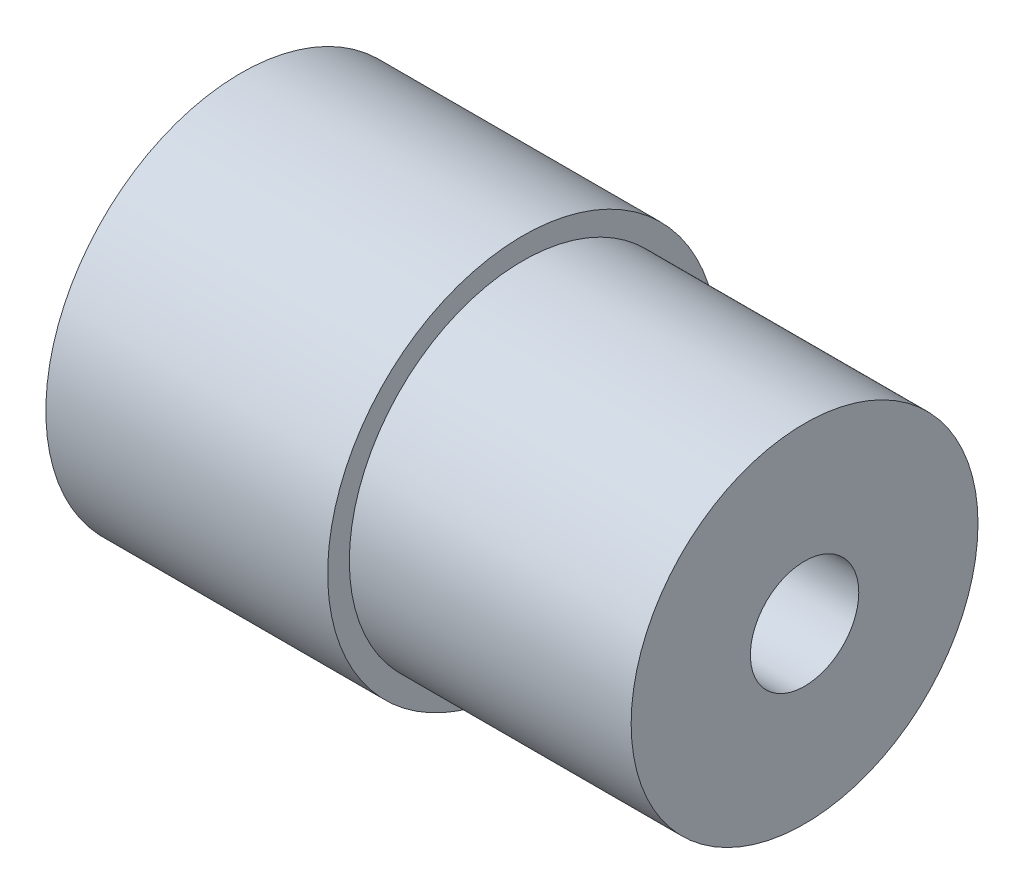
ISO-10303-21;
HEADER;
FILE_DESCRIPTION(('STEP AP214'),'2;1');
FILE_NAME('part.step','',(''),(''),'','','');
FILE_SCHEMA(('AUTOMOTIVE_DESIGN { 1 0 10303 214 1 1 1 1 }'));
ENDSEC;
DATA;
#1=APPLICATION_CONTEXT('core data for automotive mechanical design processes');
#2=APPLICATION_PROTOCOL_DEFINITION('international standard','automotive_design',2000,#1);
#3=PRODUCT_CONTEXT('',#1,'mechanical');
#4=PRODUCT('Part','Part','',(#3));
#5=PRODUCT_RELATED_PRODUCT_CATEGORY('part','',(#4));
#6=PRODUCT_DEFINITION_FORMATION('','',#4);
#7=PRODUCT_DEFINITION_CONTEXT('part definition',#1,'design');
#8=PRODUCT_DEFINITION('design','',#6,#7);
#9=PRODUCT_DEFINITION_SHAPE('','',#8);
#10=(LENGTH_UNIT() NAMED_UNIT(*) SI_UNIT(.MILLI.,.METRE.));
#11=(NAMED_UNIT(*) PLANE_ANGLE_UNIT() SI_UNIT($,.RADIAN.));
#12=(NAMED_UNIT(*) SI_UNIT($,.STERADIAN.) SOLID_ANGLE_UNIT());
#13=UNCERTAINTY_MEASURE_WITH_UNIT(LENGTH_MEASURE(1.E-05),#10,'distance_accuracy_value','');
#14=(GEOMETRIC_REPRESENTATION_CONTEXT(3) GLOBAL_UNCERTAINTY_ASSIGNED_CONTEXT((#13)) GLOBAL_UNIT_ASSIGNED_CONTEXT((#10,
#11,#12)) REPRESENTATION_CONTEXT('',''));
#15=CARTESIAN_POINT('',(0.,0.,0.));
#16=DIRECTION('',(0.,0.,1.));
#17=DIRECTION('',(1.,0.,0.));
#18=AXIS2_PLACEMENT_3D('',#15,#16,#17);
#19=CARTESIAN_POINT('',(0.,0.,0.));
#20=DIRECTION('',(1.,0.,0.));
#21=DIRECTION('',(0.,0.,-1.));
#22=AXIS2_PLACEMENT_3D('',#19,#20,#21);
#23=PLANE('',#22);
#24=CARTESIAN_POINT('',(0.,0.,0.));
#25=DIRECTION('',(1.,0.,0.));
#26=DIRECTION('',(0.,0.,-1.));
#27=AXIS2_PLACEMENT_3D('',#24,#25,#26);
#28=CIRCLE('',#27,2.5);
#29=CARTESIAN_POINT('',(0.,0.,-2.5));
#30=VERTEX_POINT('',#29);
#31=EDGE_CURVE('E58',#30,#30,#28,.T.);
#32=ORIENTED_EDGE('',*,*,#31,.F.);
#33=EDGE_LOOP('',(#32));
#34=FACE_BOUND('',#33,.T.);
#35=CARTESIAN_POINT('',(0.,0.,0.));
#36=DIRECTION('',(1.,0.,0.));
#37=DIRECTION('',(0.,0.,-1.));
#38=AXIS2_PLACEMENT_3D('',#35,#36,#37);
#39=CIRCLE('',#38,8.);
#40=CARTESIAN_POINT('',(0.,0.,-8.));
#41=VERTEX_POINT('',#40);
#42=EDGE_CURVE('E11',#41,#41,#39,.T.);
#43=ORIENTED_EDGE('',*,*,#42,.T.);
#44=EDGE_LOOP('',(#43));
#45=FACE_BOUND('',#44,.T.);
#46=ADVANCED_FACE('F35',(#34,#45),#23,.T.);
#47=CARTESIAN_POINT('',(0.,0.,0.));
#48=DIRECTION('',(1.,0.,0.));
#49=DIRECTION('',(0.,0.,-1.));
#50=AXIS2_PLACEMENT_3D('',#47,#48,#49);
#51=CYLINDRICAL_SURFACE('',#50,8.);
#52=CARTESIAN_POINT('',(-6.,-7.85811682275086,1.5));
#53=CARTESIAN_POINT('',(-6.08345720801174,-7.85811843793494,1.49999679883246));
#54=CARTESIAN_POINT('',(-6.16695594821839,-7.85946079760266,1.49301126348936));
#55=CARTESIAN_POINT('',(-6.33159896158191,-7.86467851014364,1.46527253251805));
#56=CARTESIAN_POINT('',(-6.41274117642748,-7.86855601173205,1.44450765768477));
#57=CARTESIAN_POINT('',(-6.57026507137087,-7.87838976464885,1.38987035617788));
#58=CARTESIAN_POINT('',(-6.64665110930729,-7.88434407905997,1.35601013954374));
#59=CARTESIAN_POINT('',(-6.79265355928681,-7.89765826320959,1.27617565760366));
#60=CARTESIAN_POINT('',(-6.8622704990033,-7.90501802325622,1.23020233759193));
#61=CARTESIAN_POINT('',(-6.99363019919913,-7.92041614838944,1.12683678942622));
#62=CARTESIAN_POINT('',(-7.05527648347173,-7.92846116625679,1.06932292933092));
#63=CARTESIAN_POINT('',(-7.16810438959956,-7.94426457664034,0.94477177880355));
#64=CARTESIAN_POINT('',(-7.21928532442479,-7.95202295031153,0.877733863624943));
#65=CARTESIAN_POINT('',(-7.31009937660052,-7.96645017828405,0.735403894570162));
#66=CARTESIAN_POINT('',(-7.34964153351942,-7.97311028052363,0.660052840033865));
#67=CARTESIAN_POINT('',(-7.41546954227353,-7.98451608632931,0.503631283250762));
#68=CARTESIAN_POINT('',(-7.44175648399022,-7.98926194728334,0.422561251859505));
#69=CARTESIAN_POINT('',(-7.48002954861113,-7.99625755123778,0.258002746187415));
#70=CARTESIAN_POINT('',(-7.49217830592269,-7.99853565976327,0.174553323244856));
#71=CARTESIAN_POINT('',(-7.5023368877004,-8.00043684615594,0.00677167603538244));
#72=CARTESIAN_POINT('',(-7.50034791613906,-8.00006015010697,-0.0775604724476709));
#73=CARTESIAN_POINT('',(-7.48241222885285,-7.99671633763241,-0.243598357899397));
#74=CARTESIAN_POINT('',(-7.46664063056999,-7.99378172247214,-0.32532376045147));
#75=CARTESIAN_POINT('',(-7.42186435060476,-7.98568826333561,-0.484947165715476));
#76=CARTESIAN_POINT('',(-7.39285918665419,-7.98052933829966,-0.562845028826541));
#77=CARTESIAN_POINT('',(-7.3222722689417,-7.96851260297339,-0.713110065751522));
#78=CARTESIAN_POINT('',(-7.2806205120875,-7.96164537590825,-0.785443571838533));
#79=CARTESIAN_POINT('',(-7.18597433092285,-7.9469714754285,-0.922159977214638));
#80=CARTESIAN_POINT('',(-7.13297875311242,-7.93916470651164,-0.986542066910785));
#81=CARTESIAN_POINT('',(-7.01618429701647,-7.92333513680567,-1.10656561896904));
#82=CARTESIAN_POINT('',(-6.95223221609792,-7.91531085901622,-1.16205790757041));
#83=CARTESIAN_POINT('',(-6.81585046872137,-7.90006508924621,-1.2615517185126));
#84=CARTESIAN_POINT('',(-6.74342067823536,-7.89284360901351,-1.30555307271182));
#85=CARTESIAN_POINT('',(-6.59194172929734,-7.88001893307121,-1.38085852224478));
#86=CARTESIAN_POINT('',(-6.51288154280936,-7.87441850530261,-1.41214093645421));
#87=CARTESIAN_POINT('',(-6.3504988158768,-7.86551242396689,-1.46093656975056));
#88=CARTESIAN_POINT('',(-6.26717675953522,-7.8622065103862,-1.47845134901108));
#89=CARTESIAN_POINT('',(-6.09998067114412,-7.85831520301005,-1.49899672649739));
#90=CARTESIAN_POINT('',(-6.01613388443448,-7.85768955816137,-1.50224164285859));
#91=CARTESIAN_POINT('',(-5.84909654491285,-7.8591219142084,-1.49472968881724));
#92=CARTESIAN_POINT('',(-5.76590595985192,-7.86117978238611,-1.48397351086433));
#93=CARTESIAN_POINT('',(-5.60324709694561,-7.86770980063205,-1.44894868195883));
#94=CARTESIAN_POINT('',(-5.5237537473751,-7.87216186690878,-1.42479238583989));
#95=CARTESIAN_POINT('',(-5.36994281026984,-7.88296134156619,-1.3637722437906));
#96=CARTESIAN_POINT('',(-5.29562560468467,-7.88930888963281,-1.32690746128795));
#97=CARTESIAN_POINT('',(-5.15333238095683,-7.90327577863685,-1.2410235311966));
#98=CARTESIAN_POINT('',(-5.08543946213393,-7.91090895425315,-1.19186899639621));
#99=CARTESIAN_POINT('',(-4.95878795978567,-7.926548113681,-1.08298344344246));
#100=CARTESIAN_POINT('',(-4.90003019844423,-7.93455413096494,-1.02325147433083));
#101=CARTESIAN_POINT('',(-4.79251623646587,-7.95016624005946,-0.893949417870384));
#102=CARTESIAN_POINT('',(-4.74390417339403,-7.95776555833305,-0.824258534095889));
#103=CARTESIAN_POINT('',(-4.65907879382234,-7.97159404810351,-0.677574523040139));
#104=CARTESIAN_POINT('',(-4.62286499997499,-7.97782327234725,-0.600581677038527));
#105=CARTESIAN_POINT('',(-4.56407990213592,-7.98818057995848,-0.441877541578683));
#106=CARTESIAN_POINT('',(-4.54143781243859,-7.99231954730142,-0.360193213078987));
#107=CARTESIAN_POINT('',(-4.51021295171011,-7.99807642083745,-0.194096227381569));
#108=CARTESIAN_POINT('',(-4.50162870133729,-7.99969459229933,-0.10968385821585));
#109=CARTESIAN_POINT('',(-4.49881469848156,-8.00022227515441,0.0580907602505103));
#110=CARTESIAN_POINT('',(-4.50436724687047,-7.99917286625032,0.141449307066269));
#111=CARTESIAN_POINT('',(-4.52919242776844,-7.99456866611703,0.3060233692792));
#112=CARTESIAN_POINT('',(-4.54846492874421,-7.99101389890671,0.38723890521369));
#113=CARTESIAN_POINT('',(-4.60009120738372,-7.98179837978045,0.545106475595486));
#114=CARTESIAN_POINT('',(-4.63242181288101,-7.97614135981576,0.621766319318225));
#115=CARTESIAN_POINT('',(-4.70922045365518,-7.96333372068771,0.768605631316695));
#116=CARTESIAN_POINT('',(-4.75368930210665,-7.95618300146483,0.838784665003272));
#117=CARTESIAN_POINT('',(-4.85425145444232,-7.94104779859941,0.971755027780007));
#118=CARTESIAN_POINT('',(-4.91050203386171,-7.93305284591272,1.03442623539053));
#119=CARTESIAN_POINT('',(-5.03270456249271,-7.91719633538833,1.14951536065485));
#120=CARTESIAN_POINT('',(-5.09865879037372,-7.90933480936765,1.2019308632478));
#121=CARTESIAN_POINT('',(-5.23912645470335,-7.89455577425926,1.29547633945385));
#122=CARTESIAN_POINT('',(-5.31371343966764,-7.88764767280729,1.33649740531872));
#123=CARTESIAN_POINT('',(-5.46882578997974,-7.87567084650033,1.40536132423417));
#124=CARTESIAN_POINT('',(-5.54934546658938,-7.87060038649116,1.43321661638912));
#125=CARTESIAN_POINT('',(-5.69175228806592,-7.86393016292125,1.46929726596175));
#126=CARTESIAN_POINT('',(-5.75280572376195,-7.86176310717932,1.4807910573985));
#127=CARTESIAN_POINT('',(-5.87589846842032,-7.85885585595504,1.49614351076215));
#128=CARTESIAN_POINT('',(-5.93793775050033,-7.85811562163282,1.50000238052127));
#129=CARTESIAN_POINT('',(-6.,-7.85811682275086,1.5));
#130=B_SPLINE_CURVE_WITH_KNOTS('',3,(#52,#53,#54,#55,#56,#57,#58,#59,#60,#61,#62,#63,#64,#65,
#66,#67,#68,#69,#70,#71,#72,#73,#74,#75,#76,#77,#78,#79,#80,#81,#82,#83,#84,#85,#86,#87,#88,#89,
#90,#91,#92,#93,#94,#95,#96,#97,#98,#99,#100,#101,#102,#103,#104,#105,#106,#107,#108,#109,#110,
#111,#112,#113,#114,#115,#116,#117,#118,#119,#120,#121,#122,#123,#124,#125,#126,#127,#128,#129),
.UNSPECIFIED.,.T.,.F.,(4,2,2,2,2,2,2,2,2,2,2,2,2,2,2,2,2,2,2,2,2,2,2,2,2,2,2,2,2,2,2,2,2,2,2,2,
2,2,4),(0.,0.250144505793187,0.500501302380393,0.750625227978432,1.00072963993908,
1.25362335698691,1.50653367069315,1.76137104348047,2.0161874593964,2.26804275460261,
2.51987660200648,2.76855650598725,3.01724547328425,3.26733691984219,3.51745380911785,
3.77140614764064,4.025362201924,4.27974936118266,4.53410768866487,4.78463248587075,
5.03514489338718,5.28358792315368,5.53204926624317,5.78337862654143,6.03473059394677,
6.28944125495871,6.54414210821705,6.79750269418683,7.0508366166733,7.30029300570138,
7.54974700322167,7.79876026530358,8.0477902135711,8.30038464008745,8.55303847730764,
8.80803001818118,9.06278015749119,9.24880307527214,9.43482092920425),.UNSPECIFIED.);
#131=CARTESIAN_POINT('',(-6.,-7.85811682275086,1.5));
#132=VERTEX_POINT('',#131);
#133=EDGE_CURVE('E85',#132,#132,#130,.T.);
#134=ORIENTED_EDGE('',*,*,#133,.F.);
#135=EDGE_LOOP('',(#134));
#136=FACE_BOUND('',#135,.T.);
#137=CARTESIAN_POINT('',(-13.,0.,0.));
#138=DIRECTION('',(1.,0.,0.));
#139=DIRECTION('',(0.,0.,-1.));
#140=AXIS2_PLACEMENT_3D('',#137,#138,#139);
#141=CIRCLE('',#140,8.);
#142=CARTESIAN_POINT('',(-13.,0.,-8.));
#143=VERTEX_POINT('',#142);
#144=EDGE_CURVE('E47',#143,#143,#141,.T.);
#145=ORIENTED_EDGE('',*,*,#144,.T.);
#146=EDGE_LOOP('',(#145));
#147=FACE_BOUND('',#146,.T.);
#148=ORIENTED_EDGE('',*,*,#42,.F.);
#149=EDGE_LOOP('',(#148));
#150=FACE_BOUND('',#149,.T.);
#151=ADVANCED_FACE('F99',(#136,#147,#150),#51,.T.);
#152=CARTESIAN_POINT('',(-13.,8.,0.));
#153=DIRECTION('',(1.,0.,0.));
#154=DIRECTION('',(0.,0.,-1.));
#155=AXIS2_PLACEMENT_3D('',#152,#153,#154);
#156=PLANE('',#155);
#157=CARTESIAN_POINT('',(-13.,0.,0.));
#158=DIRECTION('',(1.,0.,0.));
#159=DIRECTION('',(0.,0.,-1.));
#160=AXIS2_PLACEMENT_3D('',#157,#158,#159);
#161=CIRCLE('',#160,9.);
#162=CARTESIAN_POINT('',(-13.,0.,-9.));
#163=VERTEX_POINT('',#162);
#164=EDGE_CURVE('E52',#163,#163,#161,.T.);
#165=ORIENTED_EDGE('',*,*,#164,.T.);
#166=EDGE_LOOP('',(#165));
#167=FACE_BOUND('',#166,.T.);
#168=ORIENTED_EDGE('',*,*,#144,.F.);
#169=EDGE_LOOP('',(#168));
#170=FACE_BOUND('',#169,.T.);
#171=ADVANCED_FACE('F96',(#167,#170),#156,.T.);
#172=CARTESIAN_POINT('',(0.,0.,0.));
#173=DIRECTION('',(1.,0.,0.));
#174=DIRECTION('',(0.,0.,-1.));
#175=AXIS2_PLACEMENT_3D('',#172,#173,#174);
#176=CYLINDRICAL_SURFACE('',#175,9.);
#177=CARTESIAN_POINT('',(-18.5,-9.,0.));
#178=CARTESIAN_POINT('',(-18.5000033533687,-8.99999856701294,0.0836345429749289));
#179=CARTESIAN_POINT('',(-18.5070183649814,-8.9988220674782,0.167314729103293));
#180=CARTESIAN_POINT('',(-18.5348813952592,-8.99424206964832,0.332328133003826));
#181=CARTESIAN_POINT('',(-18.555742134147,-8.99083652354334,0.413659120775549));
#182=CARTESIAN_POINT('',(-18.6106492691557,-8.9821804094187,0.571562848327587));
#183=CARTESIAN_POINT('',(-18.6446848793843,-8.97693135095516,0.648139421059141));
#184=CARTESIAN_POINT('',(-18.7249473752314,-8.96516536249242,0.794485105186768));
#185=CARTESIAN_POINT('',(-18.7711728664898,-8.9586485775266,0.864254993927156));
#186=CARTESIAN_POINT('',(-18.8749730502923,-8.94499990474988,0.99568356857501));
#187=CARTESIAN_POINT('',(-18.9326414687817,-8.93786323088914,1.05726774212098));
#188=CARTESIAN_POINT('',(-19.0574887810837,-8.92381576126039,1.16993309919596));
#189=CARTESIAN_POINT('',(-19.124668274874,-8.916904979776,1.22101361963458));
#190=CARTESIAN_POINT('',(-19.2671425797182,-8.90404539455868,1.31152027536308));
#191=CARTESIAN_POINT('',(-19.3424848020829,-8.89810277454981,1.3508727317166));
#192=CARTESIAN_POINT('',(-19.4988257385804,-8.88791873876804,1.41633501924673));
#193=CARTESIAN_POINT('',(-19.5798240702066,-8.88367720808584,1.44244574493937));
#194=CARTESIAN_POINT('',(-19.7443881649139,-8.87742322105653,1.48044862667089));
#195=CARTESIAN_POINT('',(-19.8279234419008,-8.8753906109142,1.49246941748124));
#196=CARTESIAN_POINT('',(-19.9958481661301,-8.87372363361989,1.50235003517393));
#197=CARTESIAN_POINT('',(-20.0802375525004,-8.87408909674328,1.5002108642334));
#198=CARTESIAN_POINT('',(-20.2465567167653,-8.87715857318133,1.48193705903769));
#199=CARTESIAN_POINT('',(-20.3285028821271,-8.8798384399135,1.46594692913387));
#200=CARTESIAN_POINT('',(-20.4885327906975,-8.88719697126604,1.42065188424207));
#201=CARTESIAN_POINT('',(-20.5666164013331,-8.89187570443963,1.39134651259185));
#202=CARTESIAN_POINT('',(-20.7171372940646,-8.9027308760046,1.32010634765635));
#203=CARTESIAN_POINT('',(-20.7895456436487,-8.90891440264395,1.27811154832783));
#204=CARTESIAN_POINT('',(-20.926342640323,-8.92207751049005,1.18272721053446));
#205=CARTESIAN_POINT('',(-20.990730639473,-8.92905715592572,1.12933675239257));
#206=CARTESIAN_POINT('',(-21.1104956514844,-8.94313216727871,1.01188932729544));
#207=CARTESIAN_POINT('',(-21.1657511111241,-8.95022789538991,0.94770837832388));
#208=CARTESIAN_POINT('',(-21.2647266575992,-8.96365560838034,0.81092114938899));
#209=CARTESIAN_POINT('',(-21.3084466701099,-8.96998758833847,0.738314815143854));
#210=CARTESIAN_POINT('',(-21.3831213362818,-8.98118335735747,0.586623549700027));
#211=CARTESIAN_POINT('',(-21.4140652515988,-8.98604591044468,0.507533235338798));
#212=CARTESIAN_POINT('',(-21.4621965291476,-8.99374501807596,0.345179007361641));
#213=CARTESIAN_POINT('',(-21.4793850421842,-8.99658174210284,0.261915443507684));
#214=CARTESIAN_POINT('',(-21.4993528150767,-8.99988677905611,0.0946259407809775));
#215=CARTESIAN_POINT('',(-21.5022989430834,-9.0003825180767,0.0106204422906097));
#216=CARTESIAN_POINT('',(-21.4941431933431,-8.99902484652702,-0.15668386373393));
#217=CARTESIAN_POINT('',(-21.4830418561198,-8.99717152634471,-0.239982698335221));
#218=CARTESIAN_POINT('',(-21.4472450903987,-8.99134096162921,-0.402993705328056));
#219=CARTESIAN_POINT('',(-21.4226322749659,-8.98737662880786,-0.482724521031226));
#220=CARTESIAN_POINT('',(-21.3605992890803,-8.97776678673215,-0.636928130916263));
#221=CARTESIAN_POINT('',(-21.3231783994188,-8.97212118307212,-0.711400629545829));
#222=CARTESIAN_POINT('',(-21.2362093251819,-8.95970709781444,-0.853698413681372));
#223=CARTESIAN_POINT('',(-21.1865569062997,-8.95292913532213,-0.921459150562286));
#224=CARTESIAN_POINT('',(-21.076677610769,-8.9390308043514,-1.04774615130161));
#225=CARTESIAN_POINT('',(-21.016449966034,-8.93191041102928,-1.10627174381795));
#226=CARTESIAN_POINT('',(-20.8863814711572,-8.91804105141507,-1.2130456677948));
#227=CARTESIAN_POINT('',(-20.8164475006914,-8.91129669682263,-1.26118125666823));
#228=CARTESIAN_POINT('',(-20.6693882185169,-8.8990291786673,-1.34502138617699));
#229=CARTESIAN_POINT('',(-20.5922631348635,-8.89350597639612,-1.38072632086189));
#230=CARTESIAN_POINT('',(-20.4333261603127,-8.88434072218623,-1.43852299888389));
#231=CARTESIAN_POINT('',(-20.3515351429817,-8.88069092586639,-1.46067085952877));
#232=CARTESIAN_POINT('',(-20.1853279224669,-8.87566630101156,-1.49090127226697));
#233=CARTESIAN_POINT('',(-20.1009119481608,-8.87429127469633,-1.4989850471677));
#234=CARTESIAN_POINT('',(-19.9329769004226,-8.87398039850406,-1.50082371962841));
#235=CARTESIAN_POINT('',(-19.8494597728548,-8.87501433903389,-1.49475608167511));
#236=CARTESIAN_POINT('',(-19.6846524511695,-8.87933868872237,-1.46884790337411));
#237=CARTESIAN_POINT('',(-19.6033622498349,-8.88262909056728,-1.44900740766748));
#238=CARTESIAN_POINT('',(-19.4453849376244,-8.89108413769031,-1.39618469375694));
#239=CARTESIAN_POINT('',(-19.3686925939664,-8.89624660331802,-1.36321775436026));
#240=CARTESIAN_POINT('',(-19.2218985984831,-8.90786621353324,-1.28509620234954));
#241=CARTESIAN_POINT('',(-19.1517972737767,-8.91432342233039,-1.23994098524914));
#242=CARTESIAN_POINT('',(-19.0192786501354,-8.92790072427373,-1.13809133062329));
#243=CARTESIAN_POINT('',(-18.9569623899798,-8.93502777345781,-1.08126633815619));
#244=CARTESIAN_POINT('',(-18.842689037315,-8.94908623416505,-0.957965418828138));
#245=CARTESIAN_POINT('',(-18.7907343388171,-8.95601760015928,-0.891487267747582));
#246=CARTESIAN_POINT('',(-18.69833103908,-8.96895917785332,-0.750221501784168));
#247=CARTESIAN_POINT('',(-18.6579643764122,-8.97496269751862,-0.675379672519691));
#248=CARTESIAN_POINT('',(-18.5904383092341,-8.98530700561065,-0.519907841627388));
#249=CARTESIAN_POINT('',(-18.5632657513522,-8.98964944906488,-0.439283696898005));
#250=CARTESIAN_POINT('',(-18.528796835524,-8.99523474499773,-0.29862198602724));
#251=CARTESIAN_POINT('',(-18.5180153182304,-8.99701216364015,-0.239435298179069));
#252=CARTESIAN_POINT('',(-18.5036157572932,-8.99939529591672,-0.120173586191886));
#253=CARTESIAN_POINT('',(-18.4999975903176,-9.00000102972385,-0.0600985773650968));
#254=CARTESIAN_POINT('',(-18.5,-9.,0.));
#255=B_SPLINE_CURVE_WITH_KNOTS('',3,(#177,#178,#179,#180,#181,#182,#183,#184,#185,#186,#187,
#188,#189,#190,#191,#192,#193,#194,#195,#196,#197,#198,#199,#200,#201,#202,#203,#204,#205,#206,
#207,#208,#209,#210,#211,#212,#213,#214,#215,#216,#217,#218,#219,#220,#221,#222,#223,#224,#225,
#226,#227,#228,#229,#230,#231,#232,#233,#234,#235,#236,#237,#238,#239,#240,#241,#242,#243,#244,
#245,#246,#247,#248,#249,#250,#251,#252,#253,#254),.UNSPECIFIED.,.T.,.F.,(4,2,2,2,2,2,2,2,2,2,2,
2,2,2,2,2,2,2,2,2,2,2,2,2,2,2,2,2,2,2,2,2,2,2,2,2,2,2,4),(0.,0.250683950963106,
0.501598527417253,0.752308120215163,1.00298904760487,1.25581494637399,1.50865680101914,
1.76305512494304,2.01743626125709,2.26947646262055,2.52149882592532,2.77092313056246,
3.02035599015229,3.27098733979535,3.52163892408344,3.77539661946796,4.02915594981509,
4.28312813349542,4.53707906712689,4.78804730094839,5.03900587821516,5.2884468420385,
5.5379018149564,5.78956095376215,6.0412383783257,6.29552293204572,6.54979942425566,
6.80301613405064,7.05621082671971,7.30624745713621,7.55628327712881,7.80602890935734,
8.05578693017602,8.30850830516035,8.56128800327384,8.8158133896432,9.07008451278043,
9.25022548898411,9.43036336366181),.UNSPECIFIED.);
#256=CARTESIAN_POINT('',(-18.5,-9.,0.));
#257=VERTEX_POINT('',#256);
#258=EDGE_CURVE('E67',#257,#257,#255,.T.);
#259=ORIENTED_EDGE('',*,*,#258,.F.);
#260=EDGE_LOOP('',(#259));
#261=FACE_BOUND('',#260,.T.);
#262=CARTESIAN_POINT('',(-26.,0.,0.));
#263=DIRECTION('',(1.,0.,0.));
#264=DIRECTION('',(0.,0.,-1.));
#265=AXIS2_PLACEMENT_3D('',#262,#263,#264);
#266=CIRCLE('',#265,9.);
#267=CARTESIAN_POINT('',(-26.,0.,-9.));
#268=VERTEX_POINT('',#267);
#269=EDGE_CURVE('E194',#268,#268,#266,.T.);
#270=ORIENTED_EDGE('',*,*,#269,.T.);
#271=EDGE_LOOP('',(#270));
#272=FACE_BOUND('',#271,.T.);
#273=ORIENTED_EDGE('',*,*,#164,.F.);
#274=EDGE_LOOP('',(#273));
#275=FACE_BOUND('',#274,.T.);
#276=ADVANCED_FACE('F90',(#261,#272,#275),#176,.T.);
#277=CARTESIAN_POINT('',(-26.,9.,0.));
#278=DIRECTION('',(-1.,0.,0.));
#279=DIRECTION('',(0.,0.,1.));
#280=AXIS2_PLACEMENT_3D('',#277,#278,#279);
#281=PLANE('',#280);
#282=CARTESIAN_POINT('',(-26.,0.,0.));
#283=DIRECTION('',(-1.,0.,0.));
#284=DIRECTION('',(0.,0.,1.));
#285=AXIS2_PLACEMENT_3D('',#282,#283,#284);
#286=CIRCLE('',#285,4.);
#287=CARTESIAN_POINT('',(-26.,0.,4.));
#288=VERTEX_POINT('',#287);
#289=EDGE_CURVE('E115',#288,#288,#286,.T.);
#290=ORIENTED_EDGE('',*,*,#289,.F.);
#291=EDGE_LOOP('',(#290));
#292=FACE_BOUND('',#291,.T.);
#293=ORIENTED_EDGE('',*,*,#269,.F.);
#294=EDGE_LOOP('',(#293));
#295=FACE_BOUND('',#294,.T.);
#296=ADVANCED_FACE('F95',(#292,#295),#281,.T.);
#297=CARTESIAN_POINT('',(-26.,0.,0.));
#298=DIRECTION('',(1.,0.,0.));
#299=DIRECTION('',(0.,0.,-1.));
#300=AXIS2_PLACEMENT_3D('',#297,#298,#299);
#301=CYLINDRICAL_SURFACE('',#300,2.5);
#302=CARTESIAN_POINT('',(-6.,-2.,1.5));
#303=CARTESIAN_POINT('',(-6.07547897528964,-1.99999416642511,1.50000404108592));
#304=CARTESIAN_POINT('',(-6.1509384340798,-2.00433633903481,1.49426852824013));
#305=CARTESIAN_POINT('',(-6.29932390396222,-2.02092590613883,1.47174965152787));
#306=CARTESIAN_POINT('',(-6.3722471873851,-2.03318155043097,1.45495475788936));
#307=CARTESIAN_POINT('',(-6.51308364167728,-2.0636233903473,1.41143486335795));
#308=CARTESIAN_POINT('',(-6.58102883803527,-2.0817666618312,1.3847815450315));
#309=CARTESIAN_POINT('',(-6.71143745336792,-2.12185904995836,1.32252909283019));
#310=CARTESIAN_POINT('',(-6.77389922969514,-2.14380930122416,1.28692729054693));
#311=CARTESIAN_POINT('',(-6.89994901666408,-2.19228594587542,1.20271292747644));
#312=CARTESIAN_POINT('',(-6.96274095712394,-2.21904371037662,1.15304179435289));
#313=CARTESIAN_POINT('',(-7.07976476274175,-2.27226229431061,1.04426801309985));
#314=CARTESIAN_POINT('',(-7.1339901516708,-2.29872287517103,0.985158296729613));
#315=CARTESIAN_POINT('',(-7.2381338097097,-2.35175567858734,0.851442367411702));
#316=CARTESIAN_POINT('',(-7.28695446366975,-2.37803133577818,0.775851995162548));
#317=CARTESIAN_POINT('',(-7.37080972244443,-2.42443786983179,0.615654228271658));
#318=CARTESIAN_POINT('',(-7.40585697412271,-2.44457437988735,0.53105519662633));
#319=CARTESIAN_POINT('',(-7.45759592281265,-2.4747098780044,0.363771406742666));
#320=CARTESIAN_POINT('',(-7.4757203609673,-2.4854930393917,0.281674698130915));
#321=CARTESIAN_POINT('',(-7.49794280286312,-2.49874939277545,0.114970509382708));
#322=CARTESIAN_POINT('',(-7.50205397800005,-2.50123038813308,0.0303654624001528));
#323=CARTESIAN_POINT('',(-7.49638625265754,-2.49783372711539,-0.12763728373731));
#324=CARTESIAN_POINT('',(-7.48826647383069,-2.49295437513726,-0.201123832865635));
#325=CARTESIAN_POINT('',(-7.46152020435189,-2.47707997553857,-0.345464269151768));
#326=CARTESIAN_POINT('',(-7.44289293609285,-2.46608447529309,-0.416317961051202));
#327=CARTESIAN_POINT('',(-7.39583443729622,-2.43884907201719,-0.55405678046908));
#328=CARTESIAN_POINT('',(-7.367346938861,-2.42257910450824,-0.620916491037617));
#329=CARTESIAN_POINT('',(-7.30161538377446,-2.38609637638748,-0.748988660115611));
#330=CARTESIAN_POINT('',(-7.26436905294099,-2.36588259201812,-0.810199646208011));
#331=CARTESIAN_POINT('',(-7.17716090719555,-2.32037925976363,-0.933074267143199));
#332=CARTESIAN_POINT('',(-7.12621168826426,-2.2947718295215,-0.993918663198193));
#333=CARTESIAN_POINT('',(-7.01559588213982,-2.24255554245601,-1.10671465909274));
#334=CARTESIAN_POINT('',(-6.95591749652549,-2.21594536703375,-1.1586540130834));
#335=CARTESIAN_POINT('',(-6.82134659383645,-2.16111075123946,-1.25824837767417));
#336=CARTESIAN_POINT('',(-6.74549242346054,-2.13305661385124,-1.30470933188632));
#337=CARTESIAN_POINT('',(-6.58529376836339,-2.08250879557267,-1.38397217194232));
#338=CARTESIAN_POINT('',(-6.50096528387436,-2.0600049029882,-1.41679921962189));
#339=CARTESIAN_POINT('',(-6.34760636810465,-2.02895865196731,-1.46077497064842));
#340=CARTESIAN_POINT('',(-6.27995936770336,-2.01833888618316,-1.47527903312665));
#341=CARTESIAN_POINT('',(-6.14262638970052,-2.00392150777558,-1.49480872755284));
#342=CARTESIAN_POINT('',(-6.07294287951544,-2.00011596115116,-1.49984538302907));
#343=CARTESIAN_POINT('',(-5.93344831756429,-1.99988914321323,-1.50014781114183));
#344=CARTESIAN_POINT('',(-5.86363722278479,-2.00347810223984,-1.49540004697659));
#345=CARTESIAN_POINT('',(-5.72601265625144,-2.01751520788652,-1.47640290574941));
#346=CARTESIAN_POINT('',(-5.65820080775975,-2.02796877613213,-1.46214601830139));
#347=CARTESIAN_POINT('',(-5.52628542052021,-2.054317683331,-1.42488312618657));
#348=CARTESIAN_POINT('',(-5.46217736346777,-2.07020622092812,-1.40188805257362));
#349=CARTESIAN_POINT('',(-5.33852228426982,-2.10571539417587,-1.34796261057072));
#350=CARTESIAN_POINT('',(-5.278976993634,-2.12533743689999,-1.31702924888212));
#351=CARTESIAN_POINT('',(-5.15475991748775,-2.17036819177737,-1.24167439558512));
#352=CARTESIAN_POINT('',(-5.09109916490343,-2.19618239397369,-1.19582663060303));
#353=CARTESIAN_POINT('',(-4.97171451515054,-2.2482175480362,-1.09487395518701));
#354=CARTESIAN_POINT('',(-4.91599830783088,-2.27443886711455,-1.03976018672402));
#355=CARTESIAN_POINT('',(-4.80677599264957,-2.32835625910913,-0.913274837212767));
#356=CARTESIAN_POINT('',(-4.75449927339416,-2.3558007587587,-0.840721108780192));
#357=CARTESIAN_POINT('',(-4.66309722316335,-2.40537639133459,-0.68610310086802));
#358=CARTESIAN_POINT('',(-4.62396317215908,-2.42751104449411,-0.604045176134703));
#359=CARTESIAN_POINT('',(-4.56313179656863,-2.46252280092775,-0.438840232972139));
#360=CARTESIAN_POINT('',(-4.54037377220889,-2.47595588067329,-0.356205963651259));
#361=CARTESIAN_POINT('',(-4.50928539715374,-2.494407389061,-0.187383063890858));
#362=CARTESIAN_POINT('',(-4.50093870928238,-2.49943534582737,-0.10119857178197));
#363=CARTESIAN_POINT('',(-4.49932539141407,-2.50040600461976,0.0598120232009833));
#364=CARTESIAN_POINT('',(-4.50419666543697,-2.49747057186327,0.134620583589705));
#365=CARTESIAN_POINT('',(-4.52489382438162,-2.48512948412095,0.282148755978773));
#366=CARTESIAN_POINT('',(-4.5407198313216,-2.47572375706639,0.354868344701913));
#367=CARTESIAN_POINT('',(-4.58221957158379,-2.45149427526962,0.495145481978796));
#368=CARTESIAN_POINT('',(-4.60773159612924,-2.43675966858906,0.56276703260883));
#369=CARTESIAN_POINT('',(-4.66764059455475,-2.40303337447155,0.692781971999984));
#370=CARTESIAN_POINT('',(-4.7020395608596,-2.38404073252268,0.755174184199831));
#371=CARTESIAN_POINT('',(-4.78292519656876,-2.34093432659381,0.880263645295946));
#372=CARTESIAN_POINT('',(-4.83031870901687,-2.31648844639149,0.942258690439939));
#373=CARTESIAN_POINT('',(-4.93375303371772,-2.26601907350661,1.05789751536307));
#374=CARTESIAN_POINT('',(-4.98980342560791,-2.23999385274509,1.11153190956916));
#375=CARTESIAN_POINT('',(-5.1172855621777,-2.18528165666204,1.2159097535057));
#376=CARTESIAN_POINT('',(-5.1897664861655,-2.15667566270901,1.26542406663367));
#377=CARTESIAN_POINT('',(-5.34348485276654,-2.10376464485145,1.35156817210325));
#378=CARTESIAN_POINT('',(-5.42471771398141,-2.07945738811052,1.38820466322661));
#379=CARTESIAN_POINT('',(-5.5870642851372,-2.0408000304796,1.44437116535132));
#380=CARTESIAN_POINT('',(-5.66759523596125,-2.02577665830138,1.46509526060187));
#381=CARTESIAN_POINT('',(-5.83209739470368,-2.00539032320036,1.49289268240426));
#382=CARTESIAN_POINT('',(-5.91606076575871,-2.00000648744643,1.49999550595837));
#383=CARTESIAN_POINT('',(-6.,-2.,1.5));
#384=B_SPLINE_CURVE_WITH_KNOTS('',3,(#302,#303,#304,#305,#306,#307,#308,#309,#310,#311,#312,
#313,#314,#315,#316,#317,#318,#319,#320,#321,#322,#323,#324,#325,#326,#327,#328,#329,#330,#331,
#332,#333,#334,#335,#336,#337,#338,#339,#340,#341,#342,#343,#344,#345,#346,#347,#348,#349,#350,
#351,#352,#353,#354,#355,#356,#357,#358,#359,#360,#361,#362,#363,#364,#365,#366,#367,#368,#369,
#370,#371,#372,#373,#374,#375,#376,#377,#378,#379,#380,#381,#382,#383),.UNSPECIFIED.,.T.,.F.,(4,
2,2,2,2,2,2,2,2,2,2,2,2,2,2,2,2,2,2,2,2,2,2,2,2,2,2,2,2,2,2,2,2,2,2,2,2,2,2,2,4),(0.,
0.226085249493392,0.45240657433077,0.677113624991875,0.901887762215931,1.15414462390001,
1.40659128601844,1.68630157736223,1.9657544327122,2.21853330858497,2.47107452602766,
2.69230130543181,2.91354445887944,3.13607155036376,3.35865648368878,3.60782810055849,
3.85733966656908,4.13576671140276,4.41367760154768,4.62276298054683,4.83160475643976,
5.04073566011181,5.25003193304127,5.45906724365495,5.6681814915466,5.91499438482002,
6.16204457978454,6.44121828011588,6.72020638384847,6.97891479383337,7.23732973022726,
7.46129321849399,7.68525920139647,7.90563970188756,8.12606965394584,8.37042963549486,
8.61506198741954,8.89071695766603,9.16622832484805,9.41820120134353,9.66962780912276),.UNSPECIFIED.);
#385=CARTESIAN_POINT('',(-6.,-2.,1.5));
#386=VERTEX_POINT('',#385);
#387=EDGE_CURVE('E38',#386,#386,#384,.T.);
#388=ORIENTED_EDGE('',*,*,#387,.T.);
#389=EDGE_LOOP('',(#388));
#390=FACE_BOUND('',#389,.T.);
#391=CARTESIAN_POINT('',(-18.,0.,0.));
#392=DIRECTION('',(1.,0.,0.));
#393=DIRECTION('',(0.,0.,-1.));
#394=AXIS2_PLACEMENT_3D('',#391,#392,#393);
#395=CIRCLE('',#394,2.5);
#396=CARTESIAN_POINT('',(-18.,0.,-2.5));
#397=VERTEX_POINT('',#396);
#398=EDGE_CURVE('E56',#397,#397,#395,.F.);
#399=ORIENTED_EDGE('',*,*,#398,.T.);
#400=EDGE_LOOP('',(#399));
#401=FACE_BOUND('',#400,.T.);
#402=ORIENTED_EDGE('',*,*,#31,.T.);
#403=EDGE_LOOP('',(#402));
#404=FACE_BOUND('',#403,.T.);
#405=ADVANCED_FACE('F120',(#390,#401,#404),#301,.F.);
#406=CARTESIAN_POINT('',(-18.,8.,0.));
#407=DIRECTION('',(1.,0.,0.));
#408=DIRECTION('',(0.,0.,-1.));
#409=AXIS2_PLACEMENT_3D('',#406,#407,#408);
#410=PLANE('',#409);
#411=CARTESIAN_POINT('',(-18.,0.,0.));
#412=DIRECTION('',(1.,0.,0.));
#413=DIRECTION('',(0.,0.,-1.));
#414=AXIS2_PLACEMENT_3D('',#411,#412,#413);
#415=CIRCLE('',#414,4.);
#416=CARTESIAN_POINT('',(-18.,0.,-4.));
#417=VERTEX_POINT('',#416);
#418=EDGE_CURVE('E59',#417,#417,#415,.F.);
#419=ORIENTED_EDGE('',*,*,#418,.T.);
#420=EDGE_LOOP('',(#419));
#421=FACE_BOUND('',#420,.T.);
#422=ORIENTED_EDGE('',*,*,#398,.F.);
#423=EDGE_LOOP('',(#422));
#424=FACE_BOUND('',#423,.T.);
#425=ADVANCED_FACE('F136',(#421,#424),#410,.F.);
#426=CARTESIAN_POINT('',(-1.68629150101524,0.,0.));
#427=DIRECTION('',(-1.,0.,0.));
#428=DIRECTION('',(0.,0.,1.));
#429=AXIS2_PLACEMENT_3D('',#426,#427,#428);
#430=CYLINDRICAL_SURFACE('',#429,4.);
#431=CARTESIAN_POINT('',(-20.,-3.70809924354783,1.5));
#432=CARTESIAN_POINT('',(-20.0810074837208,-3.70809640633806,1.50000304106109));
#433=CARTESIAN_POINT('',(-20.1619949225036,-3.71078260240986,1.49341597549487));
#434=CARTESIAN_POINT('',(-20.3215280829132,-3.72116159304967,1.46736187895468));
#435=CARTESIAN_POINT('',(-20.400073877595,-3.72885423767112,1.44789523373263));
#436=CARTESIAN_POINT('',(-20.5523753716135,-3.748254802809,1.39689657610574));
#437=CARTESIAN_POINT('',(-20.6261420566511,-3.7599530956926,1.36539347266349));
#438=CARTESIAN_POINT('',(-20.7673718968188,-3.78603134206598,1.29131856742698));
#439=CARTESIAN_POINT('',(-20.8348331502825,-3.80041210067323,1.24874344095039));
#440=CARTESIAN_POINT('',(-20.9648903116228,-3.83103574665713,1.15146661374162));
#441=CARTESIAN_POINT('',(-21.0271285296294,-3.84733341923603,1.09630381213307));
#442=CARTESIAN_POINT('',(-21.1417228146715,-3.87949750628547,0.976395839778928));
#443=CARTESIAN_POINT('',(-21.1940767737419,-3.89536382814785,0.911648630256681));
#444=CARTESIAN_POINT('',(-21.2891395122956,-3.92552873936553,0.771694655177601));
#445=CARTESIAN_POINT('',(-21.3314594747159,-3.93975561223505,0.696206947538029));
#446=CARTESIAN_POINT('',(-21.4026511725249,-3.96438007973847,0.538555771965249));
#447=CARTESIAN_POINT('',(-21.431527571992,-3.97477900217006,0.456394630933538));
#448=CARTESIAN_POINT('',(-21.4737578957746,-3.9901869710344,0.291489341676834));
#449=CARTESIAN_POINT('',(-21.4877276274405,-3.99540915214774,0.208923197281599));
#450=CARTESIAN_POINT('',(-21.501721200945,-4.0006401410794,0.0424643637947884));
#451=CARTESIAN_POINT('',(-21.5017495776187,-4.00065064414902,-0.0414278850628305));
#452=CARTESIAN_POINT('',(-21.4882182385348,-3.99559265903894,-0.203743543064473));
#453=CARTESIAN_POINT('',(-21.4753307020512,-3.99077541996683,-0.282232178266898));
#454=CARTESIAN_POINT('',(-21.4374640847745,-3.97693274932263,-0.435839217984389));
#455=CARTESIAN_POINT('',(-21.412484147738,-3.96790701975578,-0.510957383430296));
#456=CARTESIAN_POINT('',(-21.3508295483242,-3.94637769167531,-0.656989017303102));
#457=CARTESIAN_POINT('',(-21.3139899947316,-3.93382539470077,-0.727825392287306));
#458=CARTESIAN_POINT('',(-21.2298079030706,-3.90651310225279,-0.862486607957557));
#459=CARTESIAN_POINT('',(-21.1824619769824,-3.8917523951284,-0.926309176932321));
#460=CARTESIAN_POINT('',(-21.0753727137168,-3.86052529655816,-1.04909048680093));
#461=CARTESIAN_POINT('',(-21.0150660843496,-3.84400963763883,-1.10754614526348));
#462=CARTESIAN_POINT('',(-20.8854070066784,-3.81182460645722,-1.21370395569342));
#463=CARTESIAN_POINT('',(-20.8160522934134,-3.79615544748847,-1.261403406929));
#464=CARTESIAN_POINT('',(-20.6682805325372,-3.76712703500335,-1.34565611808151));
#465=CARTESIAN_POINT('',(-20.5896965063139,-3.75382677150277,-1.38193847851831));
#466=CARTESIAN_POINT('',(-20.4269037748324,-3.73172438629003,-1.44056464441501));
#467=CARTESIAN_POINT('',(-20.3426982284063,-3.72291976205783,-1.46291620605595));
#468=CARTESIAN_POINT('',(-20.1760240376841,-3.71139597222848,-1.49190191709668));
#469=CARTESIAN_POINT('',(-20.0937158944639,-3.70836785241537,-1.49933521158966));
#470=CARTESIAN_POINT('',(-19.9289906432583,-3.70786539525016,-1.50057885636272));
#471=CARTESIAN_POINT('',(-19.8465735676475,-3.71038967003987,-1.49439261093762));
#472=CARTESIAN_POINT('',(-19.6880700777123,-3.72039381629735,-1.46929733520157));
#473=CARTESIAN_POINT('',(-19.6118688642353,-3.72763276216449,-1.45100618334224));
#474=CARTESIAN_POINT('',(-19.4636520552798,-3.74596487046362,-1.40299774640637));
#475=CARTESIAN_POINT('',(-19.3916373208319,-3.75705882250173,-1.37327812034623));
#476=CARTESIAN_POINT('',(-19.2508355619238,-3.7823624311608,-1.30200292275278));
#477=CARTESIAN_POINT('',(-19.1822707078627,-3.79667328892065,-1.26004545177047));
#478=CARTESIAN_POINT('',(-19.052871018274,-3.82662814294291,-1.16591317862479));
#479=CARTESIAN_POINT('',(-18.9920390253754,-3.84227262594077,-1.11373463696435));
#480=CARTESIAN_POINT('',(-18.8758316268049,-3.87433046553184,-0.996727340900939));
#481=CARTESIAN_POINT('',(-18.8210465912313,-3.89072969357028,-0.931306341491062));
#482=CARTESIAN_POINT('',(-18.7231616324106,-3.92149874963302,-0.791797471753151));
#483=CARTESIAN_POINT('',(-18.6800617470542,-3.93586857107664,-0.717709573322672));
#484=CARTESIAN_POINT('',(-18.6070539438004,-3.96094985704552,-0.563016329468475));
#485=CARTESIAN_POINT('',(-18.5771008762074,-3.9716738133801,-0.482434433064626));
#486=CARTESIAN_POINT('',(-18.5313435861501,-3.98829436712571,-0.316881887523254));
#487=CARTESIAN_POINT('',(-18.5155327145776,-3.99419323299412,-0.231913320723592));
#488=CARTESIAN_POINT('',(-18.4992255972452,-4.00028407317073,-0.0653355852738145));
#489=CARTESIAN_POINT('',(-18.497890516941,-4.00078860953764,0.016180768060846));
#490=CARTESIAN_POINT('',(-18.5084151594454,-3.99684889809223,0.178226786412424));
#491=CARTESIAN_POINT('',(-18.5202732908859,-3.9924052471313,0.258756569245258));
#492=CARTESIAN_POINT('',(-18.5562588514936,-3.97921089603771,0.414548248377126));
#493=CARTESIAN_POINT('',(-18.5800799058784,-3.97056791378017,0.489890731068834));
#494=CARTESIAN_POINT('',(-18.6390100133844,-3.9498778362099,0.63551547300639));
#495=CARTESIAN_POINT('',(-18.6741212033048,-3.93783009655664,0.705796771275543));
#496=CARTESIAN_POINT('',(-18.7563139435048,-3.91090618300074,0.842540176994413));
#497=CARTESIAN_POINT('',(-18.8038366405141,-3.89593240108828,0.90871754884685));
#498=CARTESIAN_POINT('',(-18.9088078301876,-3.86499507694844,1.03241734752336));
#499=CARTESIAN_POINT('',(-18.9662598658079,-3.84903118274027,1.0899366712559));
#500=CARTESIAN_POINT('',(-19.0930641316451,-3.81688129739175,1.19781214236196));
#501=CARTESIAN_POINT('',(-19.1628844021543,-3.8007280534916,1.24762999816025));
#502=CARTESIAN_POINT('',(-19.3104158695733,-3.77098325003638,1.33484709556843));
#503=CARTESIAN_POINT('',(-19.3881278840535,-3.75739195631216,1.37224504878157));
#504=CARTESIAN_POINT('',(-19.5529556809754,-3.73402269853266,1.43465886974261));
#505=CARTESIAN_POINT('',(-19.6403343665118,-3.7244380329086,1.45906002899523));
#506=CARTESIAN_POINT('',(-19.8184852719558,-3.71147994336315,1.49172356722079));
#507=CARTESIAN_POINT('',(-19.90925521271,-3.70810242179736,1.49999659339571));
#508=CARTESIAN_POINT('',(-20.,-3.70809924354783,1.5));
#509=B_SPLINE_CURVE_WITH_KNOTS('',3,(#431,#432,#433,#434,#435,#436,#437,#438,#439,#440,#441,
#442,#443,#444,#445,#446,#447,#448,#449,#450,#451,#452,#453,#454,#455,#456,#457,#458,#459,#460,
#461,#462,#463,#464,#465,#466,#467,#468,#469,#470,#471,#472,#473,#474,#475,#476,#477,#478,#479,
#480,#481,#482,#483,#484,#485,#486,#487,#488,#489,#490,#491,#492,#493,#494,#495,#496,#497,#498,
#499,#500,#501,#502,#503,#504,#505,#506,#507,#508),.UNSPECIFIED.,.T.,.F.,(4,2,2,2,2,2,2,2,2,2,2,
2,2,2,2,2,2,2,2,2,2,2,2,2,2,2,2,2,2,2,2,2,2,2,2,2,2,2,4),(0.,0.242684541416175,
0.485361814598854,0.727459856757029,0.969630679682931,1.22274652401128,1.47591628822983,
1.73770072136421,1.9993942638133,2.24980018489679,2.50012465404857,2.73806472803194,
2.97602165263335,3.21744131210668,3.45893893628976,3.71456675065874,3.97025867827335,
4.23162592252966,4.49284751635474,4.73965657740485,4.98640395388884,5.22143845928198,
5.45652113429526,5.70041561005821,5.94439948466355,6.20385016993624,6.46330169650178,
6.72185508890168,6.98028685560127,7.22365720549936,7.4669982031948,7.7044027400389,
7.94185223512831,8.18928323676987,8.43680270894964,8.69738599542079,8.95799630544242,
9.23003178870927,9.50188762323053),.UNSPECIFIED.);
#510=CARTESIAN_POINT('',(-20.,-3.70809924354783,1.5));
#511=VERTEX_POINT('',#510);
#512=EDGE_CURVE('E60',#511,#511,#509,.T.);
#513=ORIENTED_EDGE('',*,*,#512,.T.);
#514=EDGE_LOOP('',(#513));
#515=FACE_BOUND('',#514,.T.);
#516=ORIENTED_EDGE('',*,*,#289,.T.);
#517=EDGE_LOOP('',(#516));
#518=FACE_BOUND('',#517,.T.);
#519=ORIENTED_EDGE('',*,*,#418,.F.);
#520=EDGE_LOOP('',(#519));
#521=FACE_BOUND('',#520,.T.);
#522=ADVANCED_FACE('F68',(#515,#518,#521),#430,.F.);
#523=CARTESIAN_POINT('',(-20.,-9.,0.));
#524=DIRECTION('',(0.,1.,0.));
#525=DIRECTION('',(0.,0.,1.));
#526=AXIS2_PLACEMENT_3D('',#523,#524,#525);
#527=CYLINDRICAL_SURFACE('',#526,1.5);
#528=ORIENTED_EDGE('',*,*,#258,.T.);
#529=EDGE_LOOP('',(#528));
#530=FACE_BOUND('',#529,.T.);
#531=ORIENTED_EDGE('',*,*,#512,.F.);
#532=EDGE_LOOP('',(#531));
#533=FACE_BOUND('',#532,.T.);
#534=ADVANCED_FACE('F71',(#530,#533),#527,.F.);
#535=CARTESIAN_POINT('',(-6.,-9.,0.));
#536=DIRECTION('',(0.,1.,0.));
#537=DIRECTION('',(0.,0.,1.));
#538=AXIS2_PLACEMENT_3D('',#535,#536,#537);
#539=CYLINDRICAL_SURFACE('',#538,1.5);
#540=ORIENTED_EDGE('',*,*,#133,.T.);
#541=EDGE_LOOP('',(#540));
#542=FACE_BOUND('',#541,.T.);
#543=ORIENTED_EDGE('',*,*,#387,.F.);
#544=EDGE_LOOP('',(#543));
#545=FACE_BOUND('',#544,.T.);
#546=ADVANCED_FACE('F74',(#542,#545),#539,.F.);
#547=CLOSED_SHELL('',(#46,#151,#171,#276,#296,#405,#425,#522,#534,#546));
#548=MANIFOLD_SOLID_BREP('B2',#547);
#549=ADVANCED_BREP_SHAPE_REPRESENTATION('',(#18,#548),#14);
#550=SHAPE_DEFINITION_REPRESENTATION(#9,#549);
ENDSEC;
END-ISO-10303-21;
